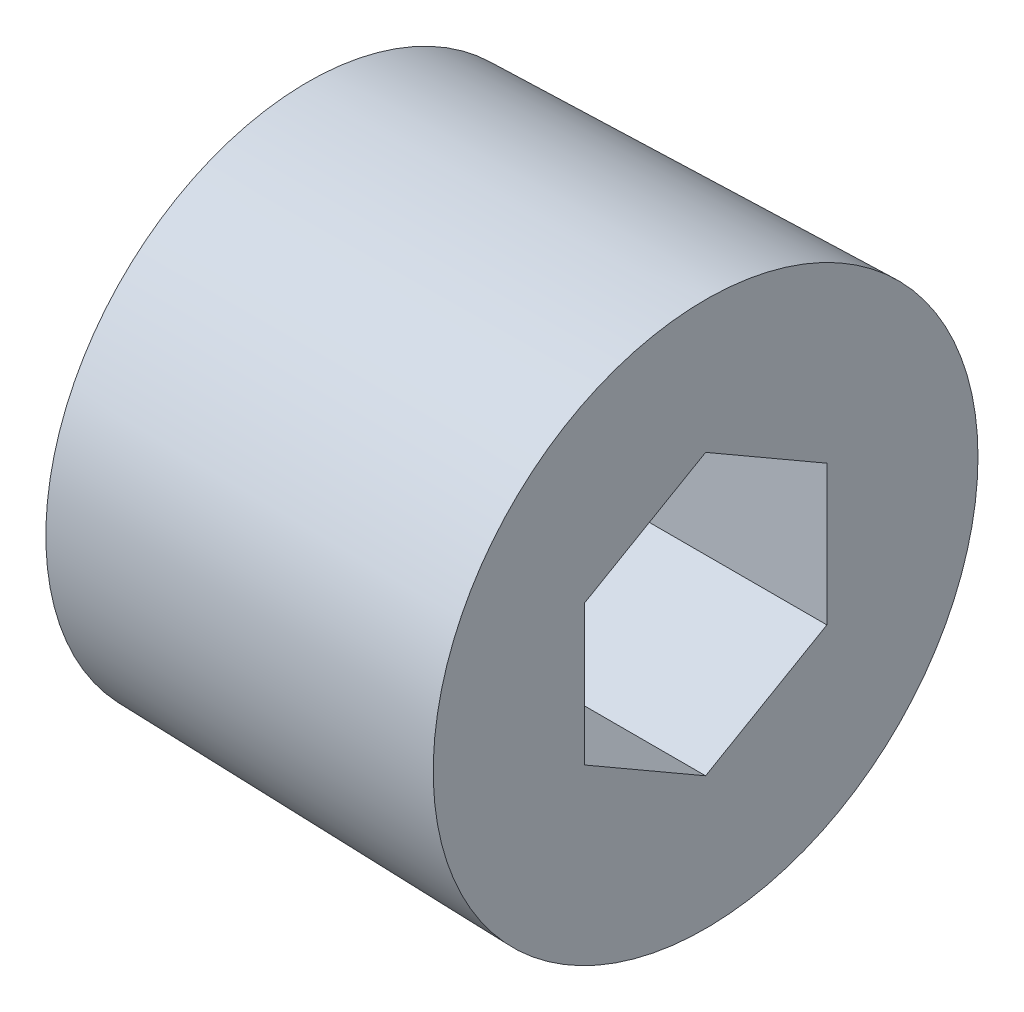
ISO-10303-21;
HEADER;
FILE_DESCRIPTION(('STEP AP214'),'2;1');
FILE_NAME('part.step','',(''),(''),'','','');
FILE_SCHEMA(('AUTOMOTIVE_DESIGN { 1 0 10303 214 1 1 1 1 }'));
ENDSEC;
DATA;
#1=APPLICATION_CONTEXT('core data for automotive mechanical design processes');
#2=APPLICATION_PROTOCOL_DEFINITION('international standard','automotive_design',2000,#1);
#3=PRODUCT_CONTEXT('',#1,'mechanical');
#4=PRODUCT('Part','Part','',(#3));
#5=PRODUCT_RELATED_PRODUCT_CATEGORY('part','',(#4));
#6=PRODUCT_DEFINITION_FORMATION('','',#4);
#7=PRODUCT_DEFINITION_CONTEXT('part definition',#1,'design');
#8=PRODUCT_DEFINITION('design','',#6,#7);
#9=PRODUCT_DEFINITION_SHAPE('','',#8);
#10=(LENGTH_UNIT() NAMED_UNIT(*) SI_UNIT(.MILLI.,.METRE.));
#11=(NAMED_UNIT(*) PLANE_ANGLE_UNIT() SI_UNIT($,.RADIAN.));
#12=(NAMED_UNIT(*) SI_UNIT($,.STERADIAN.) SOLID_ANGLE_UNIT());
#13=UNCERTAINTY_MEASURE_WITH_UNIT(LENGTH_MEASURE(1.E-05),#10,'distance_accuracy_value','');
#14=(GEOMETRIC_REPRESENTATION_CONTEXT(3) GLOBAL_UNCERTAINTY_ASSIGNED_CONTEXT((#13)) GLOBAL_UNIT_ASSIGNED_CONTEXT((#10,
#11,#12)) REPRESENTATION_CONTEXT('',''));
#15=CARTESIAN_POINT('',(0.,0.,0.));
#16=DIRECTION('',(0.,0.,1.));
#17=DIRECTION('',(1.,0.,0.));
#18=AXIS2_PLACEMENT_3D('',#15,#16,#17);
#19=CARTESIAN_POINT('',(-5.207,0.,0.));
#20=DIRECTION('',(1.,0.,0.));
#21=DIRECTION('',(0.,0.,-1.));
#22=AXIS2_PLACEMENT_3D('',#19,#20,#21);
#23=CONICAL_SURFACE('',#22,6.858,0.026179938779915);
#24=CARTESIAN_POINT('',(5.207,0.,0.));
#25=DIRECTION('',(1.,0.,0.));
#26=DIRECTION('',(0.,0.,-1.));
#27=AXIS2_PLACEMENT_3D('',#24,#25,#26);
#28=CIRCLE('',#27,7.13070018722151);
#29=CARTESIAN_POINT('',(5.207,0.,-7.13070018722151));
#30=VERTEX_POINT('',#29);
#31=EDGE_CURVE('E11',#30,#30,#28,.T.);
#32=ORIENTED_EDGE('',*,*,#31,.F.);
#33=EDGE_LOOP('',(#32));
#34=FACE_BOUND('',#33,.T.);
#35=CARTESIAN_POINT('',(-5.207,0.,0.));
#36=DIRECTION('',(1.,0.,0.));
#37=DIRECTION('',(0.,0.,-1.));
#38=AXIS2_PLACEMENT_3D('',#35,#36,#37);
#39=CIRCLE('',#38,6.858);
#40=CARTESIAN_POINT('',(-5.207,0.,-6.858));
#41=VERTEX_POINT('',#40);
#42=EDGE_CURVE('E41',#41,#41,#39,.T.);
#43=ORIENTED_EDGE('',*,*,#42,.T.);
#44=EDGE_LOOP('',(#43));
#45=FACE_BOUND('',#44,.T.);
#46=ADVANCED_FACE('F34',(#34,#45),#23,.T.);
#47=CARTESIAN_POINT('',(5.207,0.,0.));
#48=DIRECTION('',(1.,0.,0.));
#49=DIRECTION('',(0.,0.,-1.));
#50=AXIS2_PLACEMENT_3D('',#47,#48,#49);
#51=PLANE('',#50);
#52=DIRECTION('',(0.,0.5,0.866025403784439));
#53=VECTOR('',#52,1.);
#54=CARTESIAN_POINT('',(5.207,1.83308710467707,-3.17499999999999));
#55=LINE('',#54,#53);
#56=CARTESIAN_POINT('',(5.207,1.83308710467707,-3.17499999999999));
#57=VERTEX_POINT('',#56);
#58=CARTESIAN_POINT('',(5.207,3.66617420935412,0.));
#59=VERTEX_POINT('',#58);
#60=EDGE_CURVE('E48',#57,#59,#55,.T.);
#61=ORIENTED_EDGE('',*,*,#60,.F.);
#62=DIRECTION('',(0.,1.,0.));
#63=VECTOR('',#62,1.);
#64=CARTESIAN_POINT('',(5.207,-1.83308710467706,-3.175));
#65=LINE('',#64,#63);
#66=CARTESIAN_POINT('',(5.207,-1.83308710467706,-3.175));
#67=VERTEX_POINT('',#66);
#68=EDGE_CURVE('E131',#67,#57,#65,.T.);
#69=ORIENTED_EDGE('',*,*,#68,.F.);
#70=DIRECTION('',(0.,0.5,-0.866025403784439));
#71=VECTOR('',#70,1.);
#72=CARTESIAN_POINT('',(5.207,-3.66617420935412,0.));
#73=LINE('',#72,#71);
#74=CARTESIAN_POINT('',(5.207,-3.66617420935412,0.));
#75=VERTEX_POINT('',#74);
#76=EDGE_CURVE('E129',#75,#67,#73,.T.);
#77=ORIENTED_EDGE('',*,*,#76,.F.);
#78=DIRECTION('',(0.,-0.5,-0.866025403784439));
#79=VECTOR('',#78,1.);
#80=CARTESIAN_POINT('',(5.207,-1.83308710467706,3.175));
#81=LINE('',#80,#79);
#82=CARTESIAN_POINT('',(5.207,-1.83308710467706,3.175));
#83=VERTEX_POINT('',#82);
#84=EDGE_CURVE('E96',#83,#75,#81,.T.);
#85=ORIENTED_EDGE('',*,*,#84,.F.);
#86=DIRECTION('',(0.,-1.,0.));
#87=VECTOR('',#86,1.);
#88=CARTESIAN_POINT('',(5.207,1.83308710467706,3.175));
#89=LINE('',#88,#87);
#90=CARTESIAN_POINT('',(5.207,1.83308710467706,3.175));
#91=VERTEX_POINT('',#90);
#92=EDGE_CURVE('E125',#91,#83,#89,.T.);
#93=ORIENTED_EDGE('',*,*,#92,.F.);
#94=DIRECTION('',(0.,-0.5,0.866025403784439));
#95=VECTOR('',#94,1.);
#96=CARTESIAN_POINT('',(5.207,3.66617420935412,0.));
#97=LINE('',#96,#95);
#98=EDGE_CURVE('E122',#59,#91,#97,.T.);
#99=ORIENTED_EDGE('',*,*,#98,.F.);
#100=EDGE_LOOP('',(#61,#69,#77,#85,#93,#99));
#101=FACE_BOUND('',#100,.T.);
#102=ORIENTED_EDGE('',*,*,#31,.T.);
#103=EDGE_LOOP('',(#102));
#104=FACE_BOUND('',#103,.T.);
#105=ADVANCED_FACE('F146',(#101,#104),#51,.T.);
#106=CARTESIAN_POINT('',(-5.207,0.,0.));
#107=DIRECTION('',(1.,0.,0.));
#108=DIRECTION('',(0.,0.,-1.));
#109=AXIS2_PLACEMENT_3D('',#106,#107,#108);
#110=PLANE('',#109);
#111=ORIENTED_EDGE('',*,*,#42,.F.);
#112=EDGE_LOOP('',(#111));
#113=FACE_BOUND('',#112,.T.);
#114=ADVANCED_FACE('F143',(#113),#110,.F.);
#115=CARTESIAN_POINT('',(-0.3556,1.83308710467707,-3.17499999999999));
#116=DIRECTION('',(0.,0.866025403784439,-0.5));
#117=DIRECTION('',(0.,0.5,0.866025403784439));
#118=AXIS2_PLACEMENT_3D('',#115,#116,#117);
#119=PLANE('',#118);
#120=ORIENTED_EDGE('',*,*,#60,.T.);
#121=DIRECTION('',(1.,0.,0.));
#122=VECTOR('',#121,1.);
#123=CARTESIAN_POINT('',(-0.3556,3.66617420935412,0.));
#124=LINE('',#123,#122);
#125=CARTESIAN_POINT('',(-0.3556,3.66617420935412,0.));
#126=VERTEX_POINT('',#125);
#127=EDGE_CURVE('E78',#126,#59,#124,.T.);
#128=ORIENTED_EDGE('',*,*,#127,.F.);
#129=DIRECTION('',(0.,0.5,0.866025403784439));
#130=VECTOR('',#129,1.);
#131=CARTESIAN_POINT('',(-0.3556,1.83308710467707,-3.17499999999999));
#132=LINE('',#131,#130);
#133=CARTESIAN_POINT('',(-0.3556,1.83308710467707,-3.17499999999999));
#134=VERTEX_POINT('',#133);
#135=EDGE_CURVE('E133',#134,#126,#132,.T.);
#136=ORIENTED_EDGE('',*,*,#135,.F.);
#137=DIRECTION('',(1.,0.,0.));
#138=VECTOR('',#137,1.);
#139=CARTESIAN_POINT('',(-0.3556,1.83308710467707,-3.17499999999999));
#140=LINE('',#139,#138);
#141=EDGE_CURVE('E56',#134,#57,#140,.T.);
#142=ORIENTED_EDGE('',*,*,#141,.T.);
#143=EDGE_LOOP('',(#120,#128,#136,#142));
#144=FACE_BOUND('',#143,.T.);
#145=ADVANCED_FACE('F145',(#144),#119,.F.);
#146=CARTESIAN_POINT('',(-0.3556,-1.83308710467706,-3.175));
#147=DIRECTION('',(0.,0.,-1.));
#148=DIRECTION('',(0.,1.,0.));
#149=AXIS2_PLACEMENT_3D('',#146,#147,#148);
#150=PLANE('',#149);
#151=ORIENTED_EDGE('',*,*,#68,.T.);
#152=ORIENTED_EDGE('',*,*,#141,.F.);
#153=DIRECTION('',(0.,1.,0.));
#154=VECTOR('',#153,1.);
#155=CARTESIAN_POINT('',(-0.3556,-1.83308710467706,-3.175));
#156=LINE('',#155,#154);
#157=CARTESIAN_POINT('',(-0.3556,-1.83308710467706,-3.175));
#158=VERTEX_POINT('',#157);
#159=EDGE_CURVE('E108',#158,#134,#156,.T.);
#160=ORIENTED_EDGE('',*,*,#159,.F.);
#161=DIRECTION('',(1.,0.,0.));
#162=VECTOR('',#161,1.);
#163=CARTESIAN_POINT('',(-0.3556,-1.83308710467706,-3.175));
#164=LINE('',#163,#162);
#165=EDGE_CURVE('E100',#158,#67,#164,.T.);
#166=ORIENTED_EDGE('',*,*,#165,.T.);
#167=EDGE_LOOP('',(#151,#152,#160,#166));
#168=FACE_BOUND('',#167,.T.);
#169=ADVANCED_FACE('F151',(#168),#150,.F.);
#170=CARTESIAN_POINT('',(-0.3556,-3.66617420935412,0.));
#171=DIRECTION('',(0.,-0.866025403784439,-0.5));
#172=DIRECTION('',(0.,0.5,-0.866025403784439));
#173=AXIS2_PLACEMENT_3D('',#170,#171,#172);
#174=PLANE('',#173);
#175=ORIENTED_EDGE('',*,*,#76,.T.);
#176=ORIENTED_EDGE('',*,*,#165,.F.);
#177=DIRECTION('',(0.,0.5,-0.866025403784439));
#178=VECTOR('',#177,1.);
#179=CARTESIAN_POINT('',(-0.3556,-3.66617420935412,0.));
#180=LINE('',#179,#178);
#181=CARTESIAN_POINT('',(-0.3556,-3.66617420935412,0.));
#182=VERTEX_POINT('',#181);
#183=EDGE_CURVE('E104',#182,#158,#180,.T.);
#184=ORIENTED_EDGE('',*,*,#183,.F.);
#185=DIRECTION('',(1.,0.,0.));
#186=VECTOR('',#185,1.);
#187=CARTESIAN_POINT('',(-0.3556,-3.66617420935412,0.));
#188=LINE('',#187,#186);
#189=EDGE_CURVE('E89',#182,#75,#188,.T.);
#190=ORIENTED_EDGE('',*,*,#189,.T.);
#191=EDGE_LOOP('',(#175,#176,#184,#190));
#192=FACE_BOUND('',#191,.T.);
#193=ADVANCED_FACE('F105',(#192),#174,.F.);
#194=CARTESIAN_POINT('',(-0.3556,-1.83308710467706,3.175));
#195=DIRECTION('',(0.,-0.866025403784439,0.5));
#196=DIRECTION('',(0.,-0.5,-0.866025403784439));
#197=AXIS2_PLACEMENT_3D('',#194,#195,#196);
#198=PLANE('',#197);
#199=ORIENTED_EDGE('',*,*,#84,.T.);
#200=ORIENTED_EDGE('',*,*,#189,.F.);
#201=DIRECTION('',(0.,-0.5,-0.866025403784439));
#202=VECTOR('',#201,1.);
#203=CARTESIAN_POINT('',(-0.3556,-1.83308710467706,3.175));
#204=LINE('',#203,#202);
#205=CARTESIAN_POINT('',(-0.3556,-1.83308710467706,3.175));
#206=VERTEX_POINT('',#205);
#207=EDGE_CURVE('E93',#206,#182,#204,.T.);
#208=ORIENTED_EDGE('',*,*,#207,.F.);
#209=DIRECTION('',(1.,0.,0.));
#210=VECTOR('',#209,1.);
#211=CARTESIAN_POINT('',(-0.3556,-1.83308710467706,3.175));
#212=LINE('',#211,#210);
#213=EDGE_CURVE('E101',#206,#83,#212,.T.);
#214=ORIENTED_EDGE('',*,*,#213,.T.);
#215=EDGE_LOOP('',(#199,#200,#208,#214));
#216=FACE_BOUND('',#215,.T.);
#217=ADVANCED_FACE('F91',(#216),#198,.F.);
#218=CARTESIAN_POINT('',(-0.3556,1.83308710467706,3.175));
#219=DIRECTION('',(0.,0.,1.));
#220=DIRECTION('',(0.,-1.,0.));
#221=AXIS2_PLACEMENT_3D('',#218,#219,#220);
#222=PLANE('',#221);
#223=ORIENTED_EDGE('',*,*,#92,.T.);
#224=ORIENTED_EDGE('',*,*,#213,.F.);
#225=DIRECTION('',(0.,-1.,0.));
#226=VECTOR('',#225,1.);
#227=CARTESIAN_POINT('',(-0.3556,1.83308710467706,3.175));
#228=LINE('',#227,#226);
#229=CARTESIAN_POINT('',(-0.3556,1.83308710467706,3.175));
#230=VERTEX_POINT('',#229);
#231=EDGE_CURVE('E114',#230,#206,#228,.T.);
#232=ORIENTED_EDGE('',*,*,#231,.F.);
#233=DIRECTION('',(1.,0.,0.));
#234=VECTOR('',#233,1.);
#235=CARTESIAN_POINT('',(-0.3556,1.83308710467706,3.175));
#236=LINE('',#235,#234);
#237=EDGE_CURVE('E137',#230,#91,#236,.T.);
#238=ORIENTED_EDGE('',*,*,#237,.T.);
#239=EDGE_LOOP('',(#223,#224,#232,#238));
#240=FACE_BOUND('',#239,.T.);
#241=ADVANCED_FACE('F198',(#240),#222,.F.);
#242=CARTESIAN_POINT('',(-0.3556,3.66617420935412,0.));
#243=DIRECTION('',(0.,0.866025403784439,0.5));
#244=DIRECTION('',(0.,-0.5,0.866025403784439));
#245=AXIS2_PLACEMENT_3D('',#242,#243,#244);
#246=PLANE('',#245);
#247=ORIENTED_EDGE('',*,*,#98,.T.);
#248=ORIENTED_EDGE('',*,*,#237,.F.);
#249=DIRECTION('',(0.,-0.5,0.866025403784439));
#250=VECTOR('',#249,1.);
#251=CARTESIAN_POINT('',(-0.3556,3.66617420935412,0.));
#252=LINE('',#251,#250);
#253=EDGE_CURVE('E116',#126,#230,#252,.T.);
#254=ORIENTED_EDGE('',*,*,#253,.F.);
#255=ORIENTED_EDGE('',*,*,#127,.T.);
#256=EDGE_LOOP('',(#247,#248,#254,#255));
#257=FACE_BOUND('',#256,.T.);
#258=ADVANCED_FACE('F207',(#257),#246,.F.);
#259=CARTESIAN_POINT('',(-0.3556,3.66617420935412,0.));
#260=DIRECTION('',(1.,0.,0.));
#261=DIRECTION('',(0.,0.,-1.));
#262=AXIS2_PLACEMENT_3D('',#259,#260,#261);
#263=PLANE('',#262);
#264=ORIENTED_EDGE('',*,*,#135,.T.);
#265=ORIENTED_EDGE('',*,*,#253,.T.);
#266=ORIENTED_EDGE('',*,*,#231,.T.);
#267=ORIENTED_EDGE('',*,*,#207,.T.);
#268=ORIENTED_EDGE('',*,*,#183,.T.);
#269=ORIENTED_EDGE('',*,*,#159,.T.);
#270=EDGE_LOOP('',(#264,#265,#266,#267,#268,#269));
#271=FACE_BOUND('',#270,.T.);
#272=ADVANCED_FACE('F111',(#271),#263,.T.);
#273=CLOSED_SHELL('',(#46,#105,#114,#145,#169,#193,#217,#241,#258,#272));
#274=MANIFOLD_SOLID_BREP('B2',#273);
#275=ADVANCED_BREP_SHAPE_REPRESENTATION('',(#18,#274),#14);
#276=SHAPE_DEFINITION_REPRESENTATION(#9,#275);
ENDSEC;
END-ISO-10303-21;
